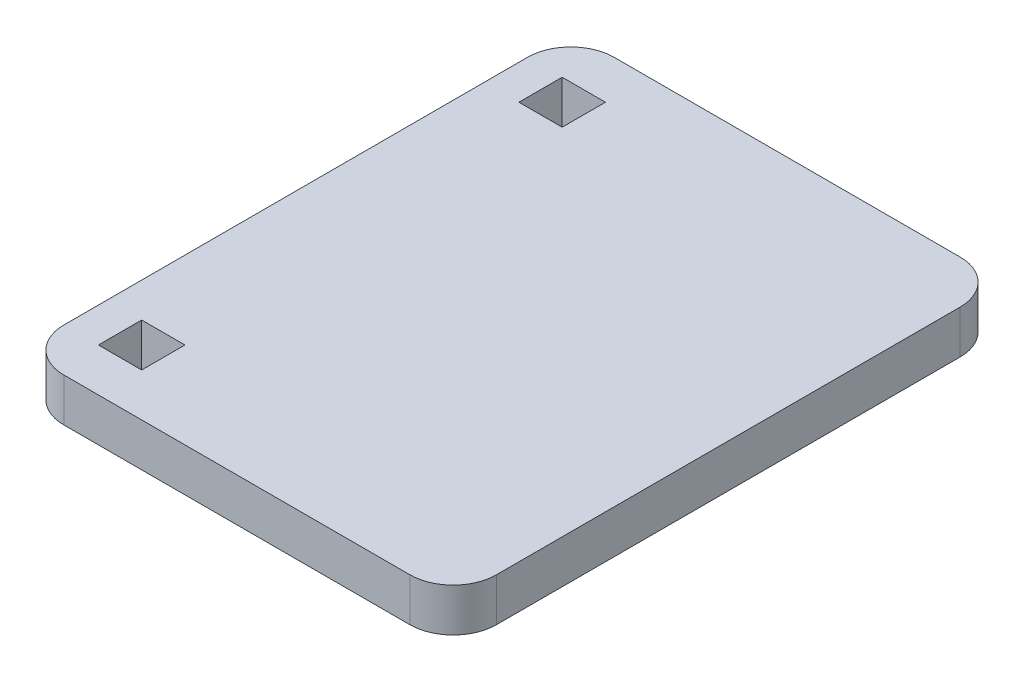
ISO-10303-21;
HEADER;
FILE_DESCRIPTION(('STEP AP214'),'2;1');
FILE_NAME('part.step','',(''),(''),'','','');
FILE_SCHEMA(('AUTOMOTIVE_DESIGN { 1 0 10303 214 1 1 1 1 }'));
ENDSEC;
DATA;
#1=APPLICATION_CONTEXT('core data for automotive mechanical design processes');
#2=APPLICATION_PROTOCOL_DEFINITION('international standard','automotive_design',2000,#1);
#3=PRODUCT_CONTEXT('',#1,'mechanical');
#4=PRODUCT('Part','Part','',(#3));
#5=PRODUCT_RELATED_PRODUCT_CATEGORY('part','',(#4));
#6=PRODUCT_DEFINITION_FORMATION('','',#4);
#7=PRODUCT_DEFINITION_CONTEXT('part definition',#1,'design');
#8=PRODUCT_DEFINITION('design','',#6,#7);
#9=PRODUCT_DEFINITION_SHAPE('','',#8);
#10=(LENGTH_UNIT() NAMED_UNIT(*) SI_UNIT(.MILLI.,.METRE.));
#11=(NAMED_UNIT(*) PLANE_ANGLE_UNIT() SI_UNIT($,.RADIAN.));
#12=(NAMED_UNIT(*) SI_UNIT($,.STERADIAN.) SOLID_ANGLE_UNIT());
#13=UNCERTAINTY_MEASURE_WITH_UNIT(LENGTH_MEASURE(1.E-05),#10,'distance_accuracy_value','');
#14=(GEOMETRIC_REPRESENTATION_CONTEXT(3) GLOBAL_UNCERTAINTY_ASSIGNED_CONTEXT((#13)) GLOBAL_UNIT_ASSIGNED_CONTEXT((#10,
#11,#12)) REPRESENTATION_CONTEXT('',''));
#15=CARTESIAN_POINT('',(0.,0.,0.));
#16=DIRECTION('',(0.,0.,1.));
#17=DIRECTION('',(1.,0.,0.));
#18=AXIS2_PLACEMENT_3D('',#15,#16,#17);
#19=CARTESIAN_POINT('',(5.00000000000001,5.,58.6));
#20=DIRECTION('',(0.,1.,0.));
#21=DIRECTION('',(0.,0.,1.));
#22=AXIS2_PLACEMENT_3D('',#19,#20,#21);
#23=PLANE('',#22);
#24=CARTESIAN_POINT('',(5.00000000000001,5.,58.6));
#25=DIRECTION('',(0.,1.,0.));
#26=DIRECTION('',(0.,0.,1.));
#27=AXIS2_PLACEMENT_3D('',#24,#25,#26);
#28=CIRCLE('',#27,5.);
#29=CARTESIAN_POINT('',(0.,5.,58.6));
#30=VERTEX_POINT('',#29);
#31=CARTESIAN_POINT('',(5.00000000000001,5.,63.6));
#32=VERTEX_POINT('',#31);
#33=EDGE_CURVE('E213',#30,#32,#28,.T.);
#34=ORIENTED_EDGE('',*,*,#33,.T.);
#35=DIRECTION('',(1.,0.,0.));
#36=VECTOR('',#35,1.);
#37=CARTESIAN_POINT('',(5.00000000000001,5.,63.6));
#38=LINE('',#37,#36);
#39=CARTESIAN_POINT('',(45.,5.,63.6));
#40=VERTEX_POINT('',#39);
#41=EDGE_CURVE('E216',#32,#40,#38,.T.);
#42=ORIENTED_EDGE('',*,*,#41,.T.);
#43=CARTESIAN_POINT('',(45.,5.,58.6));
#44=DIRECTION('',(0.,1.,0.));
#45=DIRECTION('',(0.,0.,1.));
#46=AXIS2_PLACEMENT_3D('',#43,#44,#45);
#47=CIRCLE('',#46,5.);
#48=CARTESIAN_POINT('',(50.,5.,58.6));
#49=VERTEX_POINT('',#48);
#50=EDGE_CURVE('E219',#40,#49,#47,.T.);
#51=ORIENTED_EDGE('',*,*,#50,.T.);
#52=DIRECTION('',(0.,0.,-1.));
#53=VECTOR('',#52,1.);
#54=CARTESIAN_POINT('',(50.,5.,5.00000000000004));
#55=LINE('',#54,#53);
#56=CARTESIAN_POINT('',(50.,5.,5.00000000000004));
#57=VERTEX_POINT('',#56);
#58=EDGE_CURVE('E221',#49,#57,#55,.T.);
#59=ORIENTED_EDGE('',*,*,#58,.T.);
#60=CARTESIAN_POINT('',(45.,5.,5.));
#61=DIRECTION('',(0.,1.,0.));
#62=DIRECTION('',(0.,0.,1.));
#63=AXIS2_PLACEMENT_3D('',#60,#61,#62);
#64=CIRCLE('',#63,5.);
#65=CARTESIAN_POINT('',(45.,5.,0.));
#66=VERTEX_POINT('',#65);
#67=EDGE_CURVE('E223',#57,#66,#64,.T.);
#68=ORIENTED_EDGE('',*,*,#67,.T.);
#69=DIRECTION('',(-1.,0.,0.));
#70=VECTOR('',#69,1.);
#71=CARTESIAN_POINT('',(5.00000000000004,5.,0.));
#72=LINE('',#71,#70);
#73=CARTESIAN_POINT('',(5.,5.,0.));
#74=VERTEX_POINT('',#73);
#75=EDGE_CURVE('E225',#66,#74,#72,.T.);
#76=ORIENTED_EDGE('',*,*,#75,.T.);
#77=CARTESIAN_POINT('',(5.,5.,5.));
#78=DIRECTION('',(0.,1.,0.));
#79=DIRECTION('',(0.,0.,-1.));
#80=AXIS2_PLACEMENT_3D('',#77,#78,#79);
#81=CIRCLE('',#80,5.);
#82=CARTESIAN_POINT('',(0.,5.,5.00000000000004));
#83=VERTEX_POINT('',#82);
#84=EDGE_CURVE('E227',#74,#83,#81,.T.);
#85=ORIENTED_EDGE('',*,*,#84,.T.);
#86=DIRECTION('',(0.,0.,1.));
#87=VECTOR('',#86,1.);
#88=CARTESIAN_POINT('',(0.,5.,5.00000000000004));
#89=LINE('',#88,#87);
#90=EDGE_CURVE('E229',#83,#30,#89,.T.);
#91=ORIENTED_EDGE('',*,*,#90,.T.);
#92=EDGE_LOOP('',(#34,#42,#51,#59,#68,#76,#85,#91));
#93=FACE_BOUND('',#92,.T.);
#94=DIRECTION('',(0.,0.,1.));
#95=VECTOR('',#94,1.);
#96=CARTESIAN_POINT('',(4.00000000000001,5.,53.6));
#97=LINE('',#96,#95);
#98=CARTESIAN_POINT('',(4.00000000000001,5.,53.6));
#99=VERTEX_POINT('',#98);
#100=CARTESIAN_POINT('',(4.00000000000001,5.,58.6));
#101=VERTEX_POINT('',#100);
#102=EDGE_CURVE('E184',#99,#101,#97,.T.);
#103=ORIENTED_EDGE('',*,*,#102,.F.);
#104=DIRECTION('',(-1.,0.,0.));
#105=VECTOR('',#104,1.);
#106=CARTESIAN_POINT('',(4.00000000000001,5.,53.6));
#107=LINE('',#106,#105);
#108=CARTESIAN_POINT('',(9.00000000000001,5.,53.6));
#109=VERTEX_POINT('',#108);
#110=EDGE_CURVE('E182',#109,#99,#107,.T.);
#111=ORIENTED_EDGE('',*,*,#110,.F.);
#112=DIRECTION('',(0.,0.,-1.));
#113=VECTOR('',#112,1.);
#114=CARTESIAN_POINT('',(9.00000000000001,5.,53.6));
#115=LINE('',#114,#113);
#116=CARTESIAN_POINT('',(9.00000000000001,5.,58.6));
#117=VERTEX_POINT('',#116);
#118=EDGE_CURVE('E190',#117,#109,#115,.T.);
#119=ORIENTED_EDGE('',*,*,#118,.F.);
#120=DIRECTION('',(1.,0.,0.));
#121=VECTOR('',#120,1.);
#122=CARTESIAN_POINT('',(4.00000000000001,5.,58.6));
#123=LINE('',#122,#121);
#124=EDGE_CURVE('E187',#101,#117,#123,.T.);
#125=ORIENTED_EDGE('',*,*,#124,.F.);
#126=EDGE_LOOP('',(#103,#111,#119,#125));
#127=FACE_BOUND('',#126,.T.);
#128=DIRECTION('',(-1.,0.,0.));
#129=VECTOR('',#128,1.);
#130=CARTESIAN_POINT('',(4.00000000000001,5.,5.));
#131=LINE('',#130,#129);
#132=CARTESIAN_POINT('',(9.00000000000001,5.,5.));
#133=VERTEX_POINT('',#132);
#134=CARTESIAN_POINT('',(4.00000000000001,5.,5.));
#135=VERTEX_POINT('',#134);
#136=EDGE_CURVE('E154',#133,#135,#131,.T.);
#137=ORIENTED_EDGE('',*,*,#136,.F.);
#138=DIRECTION('',(0.,0.,-1.));
#139=VECTOR('',#138,1.);
#140=CARTESIAN_POINT('',(9.00000000000001,5.,10.));
#141=LINE('',#140,#139);
#142=CARTESIAN_POINT('',(9.00000000000001,5.,10.));
#143=VERTEX_POINT('',#142);
#144=EDGE_CURVE('E146',#143,#133,#141,.T.);
#145=ORIENTED_EDGE('',*,*,#144,.F.);
#146=DIRECTION('',(1.,0.,0.));
#147=VECTOR('',#146,1.);
#148=CARTESIAN_POINT('',(4.00000000000001,5.,10.));
#149=LINE('',#148,#147);
#150=CARTESIAN_POINT('',(4.00000000000001,5.,10.));
#151=VERTEX_POINT('',#150);
#152=EDGE_CURVE('E168',#151,#143,#149,.T.);
#153=ORIENTED_EDGE('',*,*,#152,.F.);
#154=DIRECTION('',(0.,0.,1.));
#155=VECTOR('',#154,1.);
#156=CARTESIAN_POINT('',(4.00000000000001,5.,10.));
#157=LINE('',#156,#155);
#158=EDGE_CURVE('E166',#135,#151,#157,.T.);
#159=ORIENTED_EDGE('',*,*,#158,.F.);
#160=EDGE_LOOP('',(#137,#145,#153,#159));
#161=FACE_BOUND('',#160,.T.);
#162=ADVANCED_FACE('F33',(#93,#127,#161),#23,.T.);
#163=CARTESIAN_POINT('',(5.00000000000001,0.,58.6));
#164=DIRECTION('',(0.,1.,0.));
#165=DIRECTION('',(0.,0.,1.));
#166=AXIS2_PLACEMENT_3D('',#163,#164,#165);
#167=PLANE('',#166);
#168=DIRECTION('',(-1.,0.,0.));
#169=VECTOR('',#168,1.);
#170=CARTESIAN_POINT('',(4.00000000000001,0.,53.6));
#171=LINE('',#170,#169);
#172=CARTESIAN_POINT('',(9.00000000000001,0.,53.6));
#173=VERTEX_POINT('',#172);
#174=CARTESIAN_POINT('',(4.00000000000001,0.,53.6));
#175=VERTEX_POINT('',#174);
#176=EDGE_CURVE('E162',#173,#175,#171,.T.);
#177=ORIENTED_EDGE('',*,*,#176,.T.);
#178=DIRECTION('',(0.,0.,1.));
#179=VECTOR('',#178,1.);
#180=CARTESIAN_POINT('',(4.00000000000001,0.,53.6));
#181=LINE('',#180,#179);
#182=CARTESIAN_POINT('',(4.00000000000001,0.,58.6));
#183=VERTEX_POINT('',#182);
#184=EDGE_CURVE('E195',#175,#183,#181,.T.);
#185=ORIENTED_EDGE('',*,*,#184,.T.);
#186=DIRECTION('',(1.,0.,0.));
#187=VECTOR('',#186,1.);
#188=CARTESIAN_POINT('',(4.00000000000001,0.,58.6));
#189=LINE('',#188,#187);
#190=CARTESIAN_POINT('',(9.00000000000001,0.,58.6));
#191=VERTEX_POINT('',#190);
#192=EDGE_CURVE('E198',#183,#191,#189,.T.);
#193=ORIENTED_EDGE('',*,*,#192,.T.);
#194=DIRECTION('',(0.,0.,-1.));
#195=VECTOR('',#194,1.);
#196=CARTESIAN_POINT('',(9.00000000000001,0.,53.6));
#197=LINE('',#196,#195);
#198=EDGE_CURVE('E185',#191,#173,#197,.T.);
#199=ORIENTED_EDGE('',*,*,#198,.T.);
#200=EDGE_LOOP('',(#177,#185,#193,#199));
#201=FACE_BOUND('',#200,.T.);
#202=CARTESIAN_POINT('',(5.00000000000001,0.,58.6));
#203=DIRECTION('',(0.,1.,0.));
#204=DIRECTION('',(0.,0.,1.));
#205=AXIS2_PLACEMENT_3D('',#202,#203,#204);
#206=CIRCLE('',#205,5.);
#207=CARTESIAN_POINT('',(0.,0.,58.6));
#208=VERTEX_POINT('',#207);
#209=CARTESIAN_POINT('',(5.00000000000001,0.,63.6));
#210=VERTEX_POINT('',#209);
#211=EDGE_CURVE('E212',#208,#210,#206,.T.);
#212=ORIENTED_EDGE('',*,*,#211,.F.);
#213=DIRECTION('',(0.,0.,1.));
#214=VECTOR('',#213,1.);
#215=CARTESIAN_POINT('',(0.,0.,5.00000000000004));
#216=LINE('',#215,#214);
#217=CARTESIAN_POINT('',(0.,0.,5.00000000000004));
#218=VERTEX_POINT('',#217);
#219=EDGE_CURVE('E217',#218,#208,#216,.T.);
#220=ORIENTED_EDGE('',*,*,#219,.F.);
#221=CARTESIAN_POINT('',(5.,0.,5.));
#222=DIRECTION('',(0.,1.,0.));
#223=DIRECTION('',(0.,0.,-1.));
#224=AXIS2_PLACEMENT_3D('',#221,#222,#223);
#225=CIRCLE('',#224,5.);
#226=CARTESIAN_POINT('',(5.,0.,0.));
#227=VERTEX_POINT('',#226);
#228=EDGE_CURVE('E244',#227,#218,#225,.T.);
#229=ORIENTED_EDGE('',*,*,#228,.F.);
#230=DIRECTION('',(-1.,0.,0.));
#231=VECTOR('',#230,1.);
#232=CARTESIAN_POINT('',(5.00000000000004,0.,0.));
#233=LINE('',#232,#231);
#234=CARTESIAN_POINT('',(45.,0.,0.));
#235=VERTEX_POINT('',#234);
#236=EDGE_CURVE('E242',#235,#227,#233,.T.);
#237=ORIENTED_EDGE('',*,*,#236,.F.);
#238=CARTESIAN_POINT('',(45.,0.,5.));
#239=DIRECTION('',(0.,1.,0.));
#240=DIRECTION('',(0.,0.,1.));
#241=AXIS2_PLACEMENT_3D('',#238,#239,#240);
#242=CIRCLE('',#241,5.);
#243=CARTESIAN_POINT('',(50.,0.,5.00000000000004));
#244=VERTEX_POINT('',#243);
#245=EDGE_CURVE('E240',#244,#235,#242,.T.);
#246=ORIENTED_EDGE('',*,*,#245,.F.);
#247=DIRECTION('',(0.,0.,-1.));
#248=VECTOR('',#247,1.);
#249=CARTESIAN_POINT('',(50.,0.,5.00000000000004));
#250=LINE('',#249,#248);
#251=CARTESIAN_POINT('',(50.,0.,58.6));
#252=VERTEX_POINT('',#251);
#253=EDGE_CURVE('E238',#252,#244,#250,.T.);
#254=ORIENTED_EDGE('',*,*,#253,.F.);
#255=CARTESIAN_POINT('',(45.,0.,58.6));
#256=DIRECTION('',(0.,1.,0.));
#257=DIRECTION('',(0.,0.,1.));
#258=AXIS2_PLACEMENT_3D('',#255,#256,#257);
#259=CIRCLE('',#258,5.);
#260=CARTESIAN_POINT('',(45.,0.,63.6));
#261=VERTEX_POINT('',#260);
#262=EDGE_CURVE('E236',#261,#252,#259,.T.);
#263=ORIENTED_EDGE('',*,*,#262,.F.);
#264=DIRECTION('',(1.,0.,0.));
#265=VECTOR('',#264,1.);
#266=CARTESIAN_POINT('',(5.00000000000001,0.,63.6));
#267=LINE('',#266,#265);
#268=EDGE_CURVE('E234',#210,#261,#267,.T.);
#269=ORIENTED_EDGE('',*,*,#268,.F.);
#270=EDGE_LOOP('',(#212,#220,#229,#237,#246,#254,#263,#269));
#271=FACE_BOUND('',#270,.T.);
#272=DIRECTION('',(0.,0.,-1.));
#273=VECTOR('',#272,1.);
#274=CARTESIAN_POINT('',(9.00000000000001,0.,10.));
#275=LINE('',#274,#273);
#276=CARTESIAN_POINT('',(9.00000000000001,0.,10.));
#277=VERTEX_POINT('',#276);
#278=CARTESIAN_POINT('',(9.00000000000001,0.,5.));
#279=VERTEX_POINT('',#278);
#280=EDGE_CURVE('E56',#277,#279,#275,.T.);
#281=ORIENTED_EDGE('',*,*,#280,.T.);
#282=DIRECTION('',(-1.,0.,0.));
#283=VECTOR('',#282,1.);
#284=CARTESIAN_POINT('',(4.00000000000001,0.,5.));
#285=LINE('',#284,#283);
#286=CARTESIAN_POINT('',(4.00000000000001,0.,5.));
#287=VERTEX_POINT('',#286);
#288=EDGE_CURVE('E161',#279,#287,#285,.T.);
#289=ORIENTED_EDGE('',*,*,#288,.T.);
#290=DIRECTION('',(0.,0.,1.));
#291=VECTOR('',#290,1.);
#292=CARTESIAN_POINT('',(4.00000000000001,0.,10.));
#293=LINE('',#292,#291);
#294=CARTESIAN_POINT('',(4.00000000000001,0.,10.));
#295=VERTEX_POINT('',#294);
#296=EDGE_CURVE('E174',#287,#295,#293,.T.);
#297=ORIENTED_EDGE('',*,*,#296,.T.);
#298=DIRECTION('',(1.,0.,0.));
#299=VECTOR('',#298,1.);
#300=CARTESIAN_POINT('',(4.00000000000001,0.,10.));
#301=LINE('',#300,#299);
#302=EDGE_CURVE('E155',#295,#277,#301,.T.);
#303=ORIENTED_EDGE('',*,*,#302,.T.);
#304=EDGE_LOOP('',(#281,#289,#297,#303));
#305=FACE_BOUND('',#304,.T.);
#306=ADVANCED_FACE('F274',(#201,#271,#305),#167,.F.);
#307=CARTESIAN_POINT('',(5.00000000000001,5.,58.6));
#308=DIRECTION('',(0.,-1.,0.));
#309=DIRECTION('',(0.,0.,-1.));
#310=AXIS2_PLACEMENT_3D('',#307,#308,#309);
#311=CYLINDRICAL_SURFACE('',#310,5.);
#312=ORIENTED_EDGE('',*,*,#211,.T.);
#313=DIRECTION('',(0.,-1.,0.));
#314=VECTOR('',#313,1.);
#315=CARTESIAN_POINT('',(5.00000000000001,5.,63.6));
#316=LINE('',#315,#314);
#317=EDGE_CURVE('E11',#32,#210,#316,.T.);
#318=ORIENTED_EDGE('',*,*,#317,.F.);
#319=ORIENTED_EDGE('',*,*,#33,.F.);
#320=DIRECTION('',(0.,-1.,0.));
#321=VECTOR('',#320,1.);
#322=CARTESIAN_POINT('',(0.,5.,58.6));
#323=LINE('',#322,#321);
#324=EDGE_CURVE('E231',#30,#208,#323,.T.);
#325=ORIENTED_EDGE('',*,*,#324,.T.);
#326=EDGE_LOOP('',(#312,#318,#319,#325));
#327=FACE_BOUND('',#326,.T.);
#328=ADVANCED_FACE('F35',(#327),#311,.T.);
#329=CARTESIAN_POINT('',(5.00000000000001,5.,63.6));
#330=DIRECTION('',(0.,0.,-1.));
#331=DIRECTION('',(-1.,0.,0.));
#332=AXIS2_PLACEMENT_3D('',#329,#330,#331);
#333=PLANE('',#332);
#334=ORIENTED_EDGE('',*,*,#268,.T.);
#335=DIRECTION('',(0.,-1.,0.));
#336=VECTOR('',#335,1.);
#337=CARTESIAN_POINT('',(45.,5.,63.6));
#338=LINE('',#337,#336);
#339=EDGE_CURVE('E41',#40,#261,#338,.T.);
#340=ORIENTED_EDGE('',*,*,#339,.F.);
#341=ORIENTED_EDGE('',*,*,#41,.F.);
#342=ORIENTED_EDGE('',*,*,#317,.T.);
#343=EDGE_LOOP('',(#334,#340,#341,#342));
#344=FACE_BOUND('',#343,.T.);
#345=ADVANCED_FACE('F292',(#344),#333,.F.);
#346=CARTESIAN_POINT('',(45.,5.,58.6));
#347=DIRECTION('',(0.,-1.,0.));
#348=DIRECTION('',(0.,0.,-1.));
#349=AXIS2_PLACEMENT_3D('',#346,#347,#348);
#350=CYLINDRICAL_SURFACE('',#349,5.);
#351=ORIENTED_EDGE('',*,*,#262,.T.);
#352=DIRECTION('',(0.,-1.,0.));
#353=VECTOR('',#352,1.);
#354=CARTESIAN_POINT('',(50.,5.,58.6));
#355=LINE('',#354,#353);
#356=EDGE_CURVE('E261',#49,#252,#355,.T.);
#357=ORIENTED_EDGE('',*,*,#356,.F.);
#358=ORIENTED_EDGE('',*,*,#50,.F.);
#359=ORIENTED_EDGE('',*,*,#339,.T.);
#360=EDGE_LOOP('',(#351,#357,#358,#359));
#361=FACE_BOUND('',#360,.T.);
#362=ADVANCED_FACE('F268',(#361),#350,.T.);
#363=CARTESIAN_POINT('',(50.,5.,5.00000000000004));
#364=DIRECTION('',(-1.,0.,0.));
#365=DIRECTION('',(0.,0.,1.));
#366=AXIS2_PLACEMENT_3D('',#363,#364,#365);
#367=PLANE('',#366);
#368=ORIENTED_EDGE('',*,*,#253,.T.);
#369=DIRECTION('',(0.,-1.,0.));
#370=VECTOR('',#369,1.);
#371=CARTESIAN_POINT('',(50.,5.,5.00000000000004));
#372=LINE('',#371,#370);
#373=EDGE_CURVE('E258',#57,#244,#372,.T.);
#374=ORIENTED_EDGE('',*,*,#373,.F.);
#375=ORIENTED_EDGE('',*,*,#58,.F.);
#376=ORIENTED_EDGE('',*,*,#356,.T.);
#377=EDGE_LOOP('',(#368,#374,#375,#376));
#378=FACE_BOUND('',#377,.T.);
#379=ADVANCED_FACE('F280',(#378),#367,.F.);
#380=CARTESIAN_POINT('',(45.,5.,5.));
#381=DIRECTION('',(0.,-1.,0.));
#382=DIRECTION('',(0.,0.,-1.));
#383=AXIS2_PLACEMENT_3D('',#380,#381,#382);
#384=CYLINDRICAL_SURFACE('',#383,5.);
#385=ORIENTED_EDGE('',*,*,#245,.T.);
#386=DIRECTION('',(0.,-1.,0.));
#387=VECTOR('',#386,1.);
#388=CARTESIAN_POINT('',(45.,5.,0.));
#389=LINE('',#388,#387);
#390=EDGE_CURVE('E255',#66,#235,#389,.T.);
#391=ORIENTED_EDGE('',*,*,#390,.F.);
#392=ORIENTED_EDGE('',*,*,#67,.F.);
#393=ORIENTED_EDGE('',*,*,#373,.T.);
#394=EDGE_LOOP('',(#385,#391,#392,#393));
#395=FACE_BOUND('',#394,.T.);
#396=ADVANCED_FACE('F284',(#395),#384,.T.);
#397=CARTESIAN_POINT('',(5.00000000000004,5.,0.));
#398=DIRECTION('',(0.,0.,1.));
#399=DIRECTION('',(1.,0.,0.));
#400=AXIS2_PLACEMENT_3D('',#397,#398,#399);
#401=PLANE('',#400);
#402=ORIENTED_EDGE('',*,*,#236,.T.);
#403=DIRECTION('',(0.,-1.,0.));
#404=VECTOR('',#403,1.);
#405=CARTESIAN_POINT('',(5.,5.,0.));
#406=LINE('',#405,#404);
#407=EDGE_CURVE('E252',#74,#227,#406,.T.);
#408=ORIENTED_EDGE('',*,*,#407,.F.);
#409=ORIENTED_EDGE('',*,*,#75,.F.);
#410=ORIENTED_EDGE('',*,*,#390,.T.);
#411=EDGE_LOOP('',(#402,#408,#409,#410));
#412=FACE_BOUND('',#411,.T.);
#413=ADVANCED_FACE('F305',(#412),#401,.F.);
#414=CARTESIAN_POINT('',(5.,5.,5.));
#415=DIRECTION('',(0.,-1.,0.));
#416=DIRECTION('',(0.,0.,-1.));
#417=AXIS2_PLACEMENT_3D('',#414,#415,#416);
#418=CYLINDRICAL_SURFACE('',#417,5.);
#419=ORIENTED_EDGE('',*,*,#228,.T.);
#420=DIRECTION('',(0.,-1.,0.));
#421=VECTOR('',#420,1.);
#422=CARTESIAN_POINT('',(0.,5.,5.00000000000004));
#423=LINE('',#422,#421);
#424=EDGE_CURVE('E249',#83,#218,#423,.T.);
#425=ORIENTED_EDGE('',*,*,#424,.F.);
#426=ORIENTED_EDGE('',*,*,#84,.F.);
#427=ORIENTED_EDGE('',*,*,#407,.T.);
#428=EDGE_LOOP('',(#419,#425,#426,#427));
#429=FACE_BOUND('',#428,.T.);
#430=ADVANCED_FACE('F303',(#429),#418,.T.);
#431=CARTESIAN_POINT('',(0.,5.,5.00000000000004));
#432=DIRECTION('',(1.,0.,0.));
#433=DIRECTION('',(0.,0.,-1.));
#434=AXIS2_PLACEMENT_3D('',#431,#432,#433);
#435=PLANE('',#434);
#436=ORIENTED_EDGE('',*,*,#219,.T.);
#437=ORIENTED_EDGE('',*,*,#324,.F.);
#438=ORIENTED_EDGE('',*,*,#90,.F.);
#439=ORIENTED_EDGE('',*,*,#424,.T.);
#440=EDGE_LOOP('',(#436,#437,#438,#439));
#441=FACE_BOUND('',#440,.T.);
#442=ADVANCED_FACE('F298',(#441),#435,.F.);
#443=CARTESIAN_POINT('',(4.00000000000001,5.,53.6));
#444=DIRECTION('',(0.,0.,1.));
#445=DIRECTION('',(1.,0.,0.));
#446=AXIS2_PLACEMENT_3D('',#443,#444,#445);
#447=PLANE('',#446);
#448=ORIENTED_EDGE('',*,*,#176,.F.);
#449=DIRECTION('',(0.,-1.,0.));
#450=VECTOR('',#449,1.);
#451=CARTESIAN_POINT('',(9.00000000000001,5.,53.6));
#452=LINE('',#451,#450);
#453=EDGE_CURVE('E192',#109,#173,#452,.T.);
#454=ORIENTED_EDGE('',*,*,#453,.F.);
#455=ORIENTED_EDGE('',*,*,#110,.T.);
#456=DIRECTION('',(0.,-1.,0.));
#457=VECTOR('',#456,1.);
#458=CARTESIAN_POINT('',(4.00000000000001,5.,53.6));
#459=LINE('',#458,#457);
#460=EDGE_CURVE('E209',#99,#175,#459,.T.);
#461=ORIENTED_EDGE('',*,*,#460,.T.);
#462=EDGE_LOOP('',(#448,#454,#455,#461));
#463=FACE_BOUND('',#462,.T.);
#464=ADVANCED_FACE('F322',(#463),#447,.T.);
#465=CARTESIAN_POINT('',(4.00000000000001,5.,53.6));
#466=DIRECTION('',(1.,0.,0.));
#467=DIRECTION('',(0.,0.,-1.));
#468=AXIS2_PLACEMENT_3D('',#465,#466,#467);
#469=PLANE('',#468);
#470=ORIENTED_EDGE('',*,*,#184,.F.);
#471=ORIENTED_EDGE('',*,*,#460,.F.);
#472=ORIENTED_EDGE('',*,*,#102,.T.);
#473=DIRECTION('',(0.,-1.,0.));
#474=VECTOR('',#473,1.);
#475=CARTESIAN_POINT('',(4.00000000000001,5.,58.6));
#476=LINE('',#475,#474);
#477=EDGE_CURVE('E207',#101,#183,#476,.T.);
#478=ORIENTED_EDGE('',*,*,#477,.T.);
#479=EDGE_LOOP('',(#470,#471,#472,#478));
#480=FACE_BOUND('',#479,.T.);
#481=ADVANCED_FACE('F329',(#480),#469,.T.);
#482=CARTESIAN_POINT('',(4.00000000000001,5.,58.6));
#483=DIRECTION('',(0.,0.,-1.));
#484=DIRECTION('',(-1.,0.,0.));
#485=AXIS2_PLACEMENT_3D('',#482,#483,#484);
#486=PLANE('',#485);
#487=ORIENTED_EDGE('',*,*,#192,.F.);
#488=ORIENTED_EDGE('',*,*,#477,.F.);
#489=ORIENTED_EDGE('',*,*,#124,.T.);
#490=DIRECTION('',(0.,-1.,0.));
#491=VECTOR('',#490,1.);
#492=CARTESIAN_POINT('',(9.00000000000001,5.,58.6));
#493=LINE('',#492,#491);
#494=EDGE_CURVE('E205',#117,#191,#493,.T.);
#495=ORIENTED_EDGE('',*,*,#494,.T.);
#496=EDGE_LOOP('',(#487,#488,#489,#495));
#497=FACE_BOUND('',#496,.T.);
#498=ADVANCED_FACE('F334',(#497),#486,.T.);
#499=CARTESIAN_POINT('',(9.00000000000001,5.,53.6));
#500=DIRECTION('',(-1.,0.,0.));
#501=DIRECTION('',(0.,0.,1.));
#502=AXIS2_PLACEMENT_3D('',#499,#500,#501);
#503=PLANE('',#502);
#504=ORIENTED_EDGE('',*,*,#198,.F.);
#505=ORIENTED_EDGE('',*,*,#494,.F.);
#506=ORIENTED_EDGE('',*,*,#118,.T.);
#507=ORIENTED_EDGE('',*,*,#453,.T.);
#508=EDGE_LOOP('',(#504,#505,#506,#507));
#509=FACE_BOUND('',#508,.T.);
#510=ADVANCED_FACE('F341',(#509),#503,.T.);
#511=CARTESIAN_POINT('',(9.00000000000001,5.,10.));
#512=DIRECTION('',(-1.,0.,0.));
#513=DIRECTION('',(0.,0.,1.));
#514=AXIS2_PLACEMENT_3D('',#511,#512,#513);
#515=PLANE('',#514);
#516=ORIENTED_EDGE('',*,*,#280,.F.);
#517=DIRECTION('',(0.,-1.,0.));
#518=VECTOR('',#517,1.);
#519=CARTESIAN_POINT('',(9.00000000000001,5.,10.));
#520=LINE('',#519,#518);
#521=EDGE_CURVE('E150',#143,#277,#520,.T.);
#522=ORIENTED_EDGE('',*,*,#521,.F.);
#523=ORIENTED_EDGE('',*,*,#144,.T.);
#524=DIRECTION('',(0.,-1.,0.));
#525=VECTOR('',#524,1.);
#526=CARTESIAN_POINT('',(9.00000000000001,5.,5.));
#527=LINE('',#526,#525);
#528=EDGE_CURVE('E149',#133,#279,#527,.T.);
#529=ORIENTED_EDGE('',*,*,#528,.T.);
#530=EDGE_LOOP('',(#516,#522,#523,#529));
#531=FACE_BOUND('',#530,.T.);
#532=ADVANCED_FACE('F148',(#531),#515,.T.);
#533=CARTESIAN_POINT('',(4.00000000000001,5.,5.));
#534=DIRECTION('',(0.,0.,1.));
#535=DIRECTION('',(1.,0.,0.));
#536=AXIS2_PLACEMENT_3D('',#533,#534,#535);
#537=PLANE('',#536);
#538=ORIENTED_EDGE('',*,*,#288,.F.);
#539=ORIENTED_EDGE('',*,*,#528,.F.);
#540=ORIENTED_EDGE('',*,*,#136,.T.);
#541=DIRECTION('',(0.,-1.,0.));
#542=VECTOR('',#541,1.);
#543=CARTESIAN_POINT('',(4.00000000000001,5.,5.));
#544=LINE('',#543,#542);
#545=EDGE_CURVE('E163',#135,#287,#544,.T.);
#546=ORIENTED_EDGE('',*,*,#545,.T.);
#547=EDGE_LOOP('',(#538,#539,#540,#546));
#548=FACE_BOUND('',#547,.T.);
#549=ADVANCED_FACE('F158',(#548),#537,.T.);
#550=CARTESIAN_POINT('',(4.00000000000001,5.,10.));
#551=DIRECTION('',(1.,0.,0.));
#552=DIRECTION('',(0.,0.,-1.));
#553=AXIS2_PLACEMENT_3D('',#550,#551,#552);
#554=PLANE('',#553);
#555=ORIENTED_EDGE('',*,*,#296,.F.);
#556=ORIENTED_EDGE('',*,*,#545,.F.);
#557=ORIENTED_EDGE('',*,*,#158,.T.);
#558=DIRECTION('',(0.,-1.,0.));
#559=VECTOR('',#558,1.);
#560=CARTESIAN_POINT('',(4.00000000000001,5.,10.));
#561=LINE('',#560,#559);
#562=EDGE_CURVE('E48',#151,#295,#561,.T.);
#563=ORIENTED_EDGE('',*,*,#562,.T.);
#564=EDGE_LOOP('',(#555,#556,#557,#563));
#565=FACE_BOUND('',#564,.T.);
#566=ADVANCED_FACE('F359',(#565),#554,.T.);
#567=CARTESIAN_POINT('',(4.00000000000001,5.,10.));
#568=DIRECTION('',(0.,0.,-1.));
#569=DIRECTION('',(-1.,0.,0.));
#570=AXIS2_PLACEMENT_3D('',#567,#568,#569);
#571=PLANE('',#570);
#572=ORIENTED_EDGE('',*,*,#302,.F.);
#573=ORIENTED_EDGE('',*,*,#562,.F.);
#574=ORIENTED_EDGE('',*,*,#152,.T.);
#575=ORIENTED_EDGE('',*,*,#521,.T.);
#576=EDGE_LOOP('',(#572,#573,#574,#575));
#577=FACE_BOUND('',#576,.T.);
#578=ADVANCED_FACE('F362',(#577),#571,.T.);
#579=CLOSED_SHELL('',(#162,#306,#328,#345,#362,#379,#396,#413,#430,#442,#464,#481,#498,#510,
#532,#549,#566,#578));
#580=MANIFOLD_SOLID_BREP('B2',#579);
#581=ADVANCED_BREP_SHAPE_REPRESENTATION('',(#18,#580),#14);
#582=SHAPE_DEFINITION_REPRESENTATION(#9,#581);
ENDSEC;
END-ISO-10303-21;
